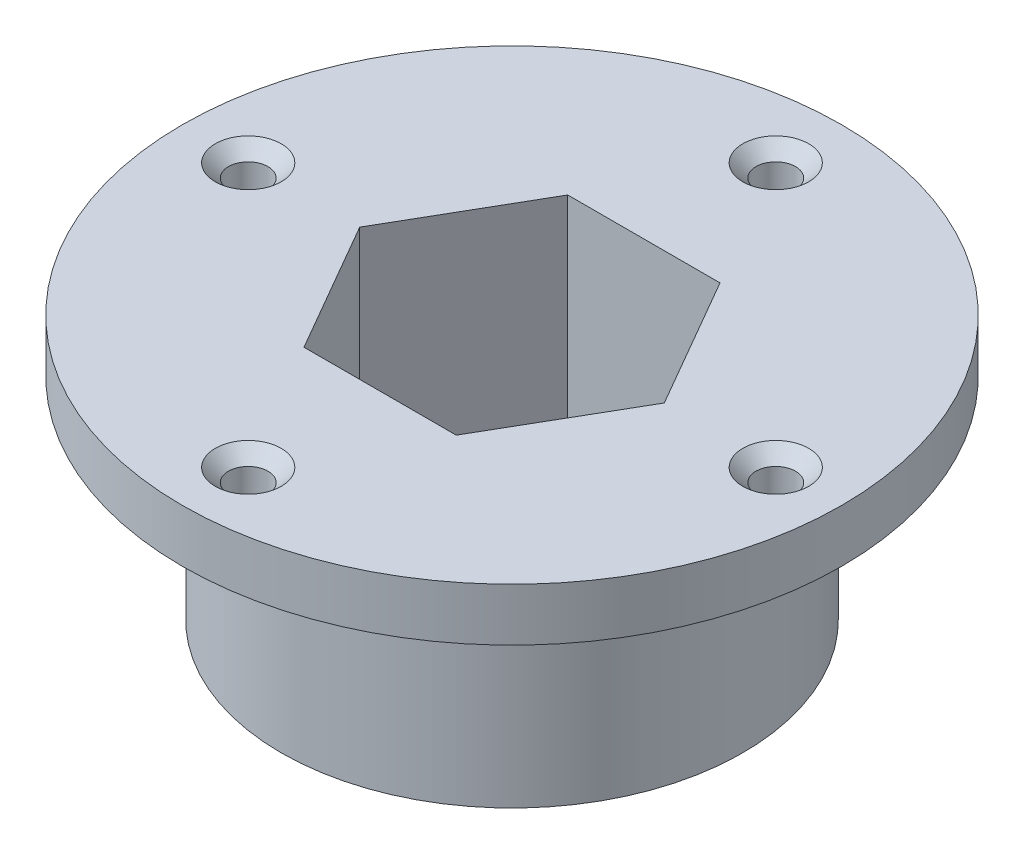
ISO-10303-21;
HEADER;
FILE_DESCRIPTION(('STEP AP214'),'2;1');
FILE_NAME('part.step','',(''),(''),'','','');
FILE_SCHEMA(('AUTOMOTIVE_DESIGN { 1 0 10303 214 1 1 1 1 }'));
ENDSEC;
DATA;
#1=APPLICATION_CONTEXT('core data for automotive mechanical design processes');
#2=APPLICATION_PROTOCOL_DEFINITION('international standard','automotive_design',2000,#1);
#3=PRODUCT_CONTEXT('',#1,'mechanical');
#4=PRODUCT('Part','Part','',(#3));
#5=PRODUCT_RELATED_PRODUCT_CATEGORY('part','',(#4));
#6=PRODUCT_DEFINITION_FORMATION('','',#4);
#7=PRODUCT_DEFINITION_CONTEXT('part definition',#1,'design');
#8=PRODUCT_DEFINITION('design','',#6,#7);
#9=PRODUCT_DEFINITION_SHAPE('','',#8);
#10=(LENGTH_UNIT() NAMED_UNIT(*) SI_UNIT(.MILLI.,.METRE.));
#11=(NAMED_UNIT(*) PLANE_ANGLE_UNIT() SI_UNIT($,.RADIAN.));
#12=(NAMED_UNIT(*) SI_UNIT($,.STERADIAN.) SOLID_ANGLE_UNIT());
#13=UNCERTAINTY_MEASURE_WITH_UNIT(LENGTH_MEASURE(1.E-05),#10,'distance_accuracy_value','');
#14=(GEOMETRIC_REPRESENTATION_CONTEXT(3) GLOBAL_UNCERTAINTY_ASSIGNED_CONTEXT((#13)) GLOBAL_UNIT_ASSIGNED_CONTEXT((#10,
#11,#12)) REPRESENTATION_CONTEXT('',''));
#15=CARTESIAN_POINT('',(0.,0.,0.));
#16=DIRECTION('',(0.,0.,1.));
#17=DIRECTION('',(1.,0.,0.));
#18=AXIS2_PLACEMENT_3D('',#15,#16,#17);
#19=CARTESIAN_POINT('',(0.,0.,0.));
#20=DIRECTION('',(0.,1.,0.));
#21=DIRECTION('',(0.,0.,1.));
#22=AXIS2_PLACEMENT_3D('',#19,#20,#21);
#23=PLANE('',#22);
#24=CARTESIAN_POINT('',(0.,0.,0.));
#25=DIRECTION('',(0.,1.,0.));
#26=DIRECTION('',(0.,0.,1.));
#27=AXIS2_PLACEMENT_3D('',#24,#25,#26);
#28=CIRCLE('',#27,17.5);
#29=CARTESIAN_POINT('',(0.,0.,17.5));
#30=VERTEX_POINT('',#29);
#31=EDGE_CURVE('E199',#30,#30,#28,.T.);
#32=ORIENTED_EDGE('',*,*,#31,.F.);
#33=EDGE_LOOP('',(#32));
#34=FACE_BOUND('',#33,.T.);
#35=DIRECTION('',(1.,0.,0.));
#36=VECTOR('',#35,1.);
#37=CARTESIAN_POINT('',(-5.77350269189626,0.,10.));
#38=LINE('',#37,#36);
#39=CARTESIAN_POINT('',(-5.77350269189626,0.,10.));
#40=VERTEX_POINT('',#39);
#41=CARTESIAN_POINT('',(5.77350269189625,0.,10.));
#42=VERTEX_POINT('',#41);
#43=EDGE_CURVE('E62',#40,#42,#38,.T.);
#44=ORIENTED_EDGE('',*,*,#43,.T.);
#45=DIRECTION('',(0.5,0.,-0.866025403784439));
#46=VECTOR('',#45,1.);
#47=CARTESIAN_POINT('',(5.77350269189625,0.,10.));
#48=LINE('',#47,#46);
#49=CARTESIAN_POINT('',(11.5470053837925,0.,0.));
#50=VERTEX_POINT('',#49);
#51=EDGE_CURVE('E170',#42,#50,#48,.T.);
#52=ORIENTED_EDGE('',*,*,#51,.T.);
#53=DIRECTION('',(-0.5,0.,-0.866025403784439));
#54=VECTOR('',#53,1.);
#55=CARTESIAN_POINT('',(11.5470053837925,0.,0.));
#56=LINE('',#55,#54);
#57=CARTESIAN_POINT('',(5.77350269189627,0.,-10.));
#58=VERTEX_POINT('',#57);
#59=EDGE_CURVE('E174',#50,#58,#56,.T.);
#60=ORIENTED_EDGE('',*,*,#59,.T.);
#61=DIRECTION('',(-1.,0.,0.));
#62=VECTOR('',#61,1.);
#63=CARTESIAN_POINT('',(5.77350269189627,0.,-10.));
#64=LINE('',#63,#62);
#65=CARTESIAN_POINT('',(-5.77350269189626,0.,-10.));
#66=VERTEX_POINT('',#65);
#67=EDGE_CURVE('E107',#58,#66,#64,.T.);
#68=ORIENTED_EDGE('',*,*,#67,.T.);
#69=DIRECTION('',(-0.5,0.,0.866025403784439));
#70=VECTOR('',#69,1.);
#71=CARTESIAN_POINT('',(-5.77350269189626,0.,-10.));
#72=LINE('',#71,#70);
#73=CARTESIAN_POINT('',(-11.5470053837925,0.,0.));
#74=VERTEX_POINT('',#73);
#75=EDGE_CURVE('E179',#66,#74,#72,.T.);
#76=ORIENTED_EDGE('',*,*,#75,.T.);
#77=DIRECTION('',(0.5,0.,0.866025403784439));
#78=VECTOR('',#77,1.);
#79=CARTESIAN_POINT('',(-11.5470053837925,0.,0.));
#80=LINE('',#79,#78);
#81=EDGE_CURVE('E183',#74,#40,#80,.T.);
#82=ORIENTED_EDGE('',*,*,#81,.T.);
#83=EDGE_LOOP('',(#44,#52,#60,#68,#76,#82));
#84=FACE_BOUND('',#83,.T.);
#85=ADVANCED_FACE('F45',(#34,#84),#23,.F.);
#86=CARTESIAN_POINT('',(0.,16.,0.));
#87=DIRECTION('',(0.,-1.,0.));
#88=DIRECTION('',(0.,0.,-1.));
#89=AXIS2_PLACEMENT_3D('',#86,#87,#88);
#90=CYLINDRICAL_SURFACE('',#89,17.5);
#91=CARTESIAN_POINT('',(0.,16.,0.));
#92=DIRECTION('',(0.,1.,0.));
#93=DIRECTION('',(0.,0.,1.));
#94=AXIS2_PLACEMENT_3D('',#91,#92,#93);
#95=CIRCLE('',#94,17.5);
#96=CARTESIAN_POINT('',(0.,16.,17.5));
#97=VERTEX_POINT('',#96);
#98=EDGE_CURVE('E200',#97,#97,#95,.T.);
#99=ORIENTED_EDGE('',*,*,#98,.F.);
#100=EDGE_LOOP('',(#99));
#101=FACE_BOUND('',#100,.T.);
#102=ORIENTED_EDGE('',*,*,#31,.T.);
#103=EDGE_LOOP('',(#102));
#104=FACE_BOUND('',#103,.T.);
#105=ADVANCED_FACE('F252',(#101,#104),#90,.T.);
#106=CARTESIAN_POINT('',(-5.77350269189626,16.,10.));
#107=DIRECTION('',(0.,0.,-1.));
#108=DIRECTION('',(-1.,0.,0.));
#109=AXIS2_PLACEMENT_3D('',#106,#107,#108);
#110=PLANE('',#109);
#111=ORIENTED_EDGE('',*,*,#43,.F.);
#112=DIRECTION('',(0.,-1.,0.));
#113=VECTOR('',#112,1.);
#114=CARTESIAN_POINT('',(-5.77350269189626,16.,10.));
#115=LINE('',#114,#113);
#116=CARTESIAN_POINT('',(-5.77350269189626,20.,10.));
#117=VERTEX_POINT('',#116);
#118=EDGE_CURVE('E187',#117,#40,#115,.T.);
#119=ORIENTED_EDGE('',*,*,#118,.F.);
#120=DIRECTION('',(1.,0.,0.));
#121=VECTOR('',#120,1.);
#122=CARTESIAN_POINT('',(-5.77350269189626,20.,10.));
#123=LINE('',#122,#121);
#124=CARTESIAN_POINT('',(5.77350269189625,20.,10.));
#125=VERTEX_POINT('',#124);
#126=EDGE_CURVE('E133',#117,#125,#123,.T.);
#127=ORIENTED_EDGE('',*,*,#126,.T.);
#128=DIRECTION('',(0.,-1.,0.));
#129=VECTOR('',#128,1.);
#130=CARTESIAN_POINT('',(5.77350269189625,16.,10.));
#131=LINE('',#130,#129);
#132=EDGE_CURVE('E196',#125,#42,#131,.T.);
#133=ORIENTED_EDGE('',*,*,#132,.T.);
#134=EDGE_LOOP('',(#111,#119,#127,#133));
#135=FACE_BOUND('',#134,.T.);
#136=ADVANCED_FACE('F258',(#135),#110,.T.);
#137=CARTESIAN_POINT('',(5.77350269189625,16.,10.));
#138=DIRECTION('',(-0.866025403784438,0.,-0.5));
#139=DIRECTION('',(-0.5,0.,0.866025403784439));
#140=AXIS2_PLACEMENT_3D('',#137,#138,#139);
#141=PLANE('',#140);
#142=ORIENTED_EDGE('',*,*,#51,.F.);
#143=ORIENTED_EDGE('',*,*,#132,.F.);
#144=DIRECTION('',(0.5,0.,-0.866025403784438));
#145=VECTOR('',#144,1.);
#146=CARTESIAN_POINT('',(5.77350269189625,20.,10.));
#147=LINE('',#146,#145);
#148=CARTESIAN_POINT('',(11.5470053837925,20.,0.));
#149=VERTEX_POINT('',#148);
#150=EDGE_CURVE('E130',#125,#149,#147,.T.);
#151=ORIENTED_EDGE('',*,*,#150,.T.);
#152=DIRECTION('',(0.,-1.,0.));
#153=VECTOR('',#152,1.);
#154=CARTESIAN_POINT('',(11.5470053837925,16.,0.));
#155=LINE('',#154,#153);
#156=EDGE_CURVE('E113',#149,#50,#155,.T.);
#157=ORIENTED_EDGE('',*,*,#156,.T.);
#158=EDGE_LOOP('',(#142,#143,#151,#157));
#159=FACE_BOUND('',#158,.T.);
#160=ADVANCED_FACE('F331',(#159),#141,.T.);
#161=CARTESIAN_POINT('',(11.5470053837925,16.,0.));
#162=DIRECTION('',(-0.866025403784439,0.,0.5));
#163=DIRECTION('',(0.5,0.,0.866025403784439));
#164=AXIS2_PLACEMENT_3D('',#161,#162,#163);
#165=PLANE('',#164);
#166=ORIENTED_EDGE('',*,*,#59,.F.);
#167=ORIENTED_EDGE('',*,*,#156,.F.);
#168=DIRECTION('',(-0.5,0.,-0.866025403784439));
#169=VECTOR('',#168,1.);
#170=CARTESIAN_POINT('',(11.5470053837925,20.,0.));
#171=LINE('',#170,#169);
#172=CARTESIAN_POINT('',(5.77350269189627,20.,-10.));
#173=VERTEX_POINT('',#172);
#174=EDGE_CURVE('E121',#149,#173,#171,.T.);
#175=ORIENTED_EDGE('',*,*,#174,.T.);
#176=DIRECTION('',(0.,-1.,0.));
#177=VECTOR('',#176,1.);
#178=CARTESIAN_POINT('',(5.77350269189627,16.,-10.));
#179=LINE('',#178,#177);
#180=EDGE_CURVE('E102',#173,#58,#179,.T.);
#181=ORIENTED_EDGE('',*,*,#180,.T.);
#182=EDGE_LOOP('',(#166,#167,#175,#181));
#183=FACE_BOUND('',#182,.T.);
#184=ADVANCED_FACE('F128',(#183),#165,.T.);
#185=CARTESIAN_POINT('',(5.77350269189627,16.,-10.));
#186=DIRECTION('',(0.,0.,1.));
#187=DIRECTION('',(1.,0.,0.));
#188=AXIS2_PLACEMENT_3D('',#185,#186,#187);
#189=PLANE('',#188);
#190=ORIENTED_EDGE('',*,*,#67,.F.);
#191=ORIENTED_EDGE('',*,*,#180,.F.);
#192=DIRECTION('',(-1.,0.,0.));
#193=VECTOR('',#192,1.);
#194=CARTESIAN_POINT('',(5.77350269189627,20.,-10.));
#195=LINE('',#194,#193);
#196=CARTESIAN_POINT('',(-5.77350269189626,20.,-10.));
#197=VERTEX_POINT('',#196);
#198=EDGE_CURVE('E105',#173,#197,#195,.T.);
#199=ORIENTED_EDGE('',*,*,#198,.T.);
#200=DIRECTION('',(0.,-1.,0.));
#201=VECTOR('',#200,1.);
#202=CARTESIAN_POINT('',(-5.77350269189626,16.,-10.));
#203=LINE('',#202,#201);
#204=EDGE_CURVE('E114',#197,#66,#203,.T.);
#205=ORIENTED_EDGE('',*,*,#204,.T.);
#206=EDGE_LOOP('',(#190,#191,#199,#205));
#207=FACE_BOUND('',#206,.T.);
#208=ADVANCED_FACE('F104',(#207),#189,.T.);
#209=CARTESIAN_POINT('',(-5.77350269189626,16.,-10.));
#210=DIRECTION('',(0.866025403784439,0.,0.5));
#211=DIRECTION('',(0.5,0.,-0.866025403784439));
#212=AXIS2_PLACEMENT_3D('',#209,#210,#211);
#213=PLANE('',#212);
#214=ORIENTED_EDGE('',*,*,#75,.F.);
#215=ORIENTED_EDGE('',*,*,#204,.F.);
#216=DIRECTION('',(-0.5,0.,0.866025403784439));
#217=VECTOR('',#216,1.);
#218=CARTESIAN_POINT('',(-5.77350269189626,20.,-10.));
#219=LINE('',#218,#217);
#220=CARTESIAN_POINT('',(-11.5470053837925,20.,0.));
#221=VERTEX_POINT('',#220);
#222=EDGE_CURVE('E124',#197,#221,#219,.T.);
#223=ORIENTED_EDGE('',*,*,#222,.T.);
#224=DIRECTION('',(0.,-1.,0.));
#225=VECTOR('',#224,1.);
#226=CARTESIAN_POINT('',(-11.5470053837925,16.,0.));
#227=LINE('',#226,#225);
#228=EDGE_CURVE('E70',#221,#74,#227,.T.);
#229=ORIENTED_EDGE('',*,*,#228,.T.);
#230=EDGE_LOOP('',(#214,#215,#223,#229));
#231=FACE_BOUND('',#230,.T.);
#232=ADVANCED_FACE('F324',(#231),#213,.T.);
#233=CARTESIAN_POINT('',(-11.5470053837925,16.,0.));
#234=DIRECTION('',(0.866025403784439,0.,-0.5));
#235=DIRECTION('',(-0.5,0.,-0.866025403784439));
#236=AXIS2_PLACEMENT_3D('',#233,#234,#235);
#237=PLANE('',#236);
#238=ORIENTED_EDGE('',*,*,#81,.F.);
#239=ORIENTED_EDGE('',*,*,#228,.F.);
#240=DIRECTION('',(0.5,0.,0.866025403784439));
#241=VECTOR('',#240,1.);
#242=CARTESIAN_POINT('',(-11.5470053837925,20.,0.));
#243=LINE('',#242,#241);
#244=EDGE_CURVE('E139',#221,#117,#243,.T.);
#245=ORIENTED_EDGE('',*,*,#244,.T.);
#246=ORIENTED_EDGE('',*,*,#118,.T.);
#247=EDGE_LOOP('',(#238,#239,#245,#246));
#248=FACE_BOUND('',#247,.T.);
#249=ADVANCED_FACE('F294',(#248),#237,.T.);
#250=CARTESIAN_POINT('',(0.,16.,0.));
#251=DIRECTION('',(0.,1.,0.));
#252=DIRECTION('',(0.,0.,1.));
#253=AXIS2_PLACEMENT_3D('',#250,#251,#252);
#254=PLANE('',#253);
#255=CARTESIAN_POINT('',(0.,16.,-20.));
#256=DIRECTION('',(0.,1.,0.));
#257=DIRECTION('',(0.,0.,1.));
#258=AXIS2_PLACEMENT_3D('',#255,#256,#257);
#259=CIRCLE('',#258,1.5);
#260=CARTESIAN_POINT('',(0.,16.,-18.5));
#261=VERTEX_POINT('',#260);
#262=EDGE_CURVE('E156',#261,#261,#259,.T.);
#263=ORIENTED_EDGE('',*,*,#262,.T.);
#264=EDGE_LOOP('',(#263));
#265=FACE_BOUND('',#264,.T.);
#266=CARTESIAN_POINT('',(20.0000000000006,16.,-5.64760248210638E-13));
#267=DIRECTION('',(0.,1.,0.));
#268=DIRECTION('',(0.,0.,1.));
#269=AXIS2_PLACEMENT_3D('',#266,#267,#268);
#270=CIRCLE('',#269,1.50000000000044);
#271=CARTESIAN_POINT('',(20.0000000000006,16.,1.49999999999988));
#272=VERTEX_POINT('',#271);
#273=EDGE_CURVE('E152',#272,#272,#270,.T.);
#274=ORIENTED_EDGE('',*,*,#273,.T.);
#275=EDGE_LOOP('',(#274));
#276=FACE_BOUND('',#275,.T.);
#277=CARTESIAN_POINT('',(1.12952049642128E-12,16.,20.));
#278=DIRECTION('',(0.,1.,0.));
#279=DIRECTION('',(0.,0.,1.));
#280=AXIS2_PLACEMENT_3D('',#277,#278,#279);
#281=CIRCLE('',#280,1.50000000000121);
#282=CARTESIAN_POINT('',(1.12952049642128E-12,16.,21.5000000000012));
#283=VERTEX_POINT('',#282);
#284=EDGE_CURVE('E148',#283,#283,#281,.T.);
#285=ORIENTED_EDGE('',*,*,#284,.T.);
#286=EDGE_LOOP('',(#285));
#287=FACE_BOUND('',#286,.T.);
#288=CARTESIAN_POINT('',(-19.9999999999994,16.,5.67209541808933E-13));
#289=DIRECTION('',(0.,1.,0.));
#290=DIRECTION('',(0.,0.,1.));
#291=AXIS2_PLACEMENT_3D('',#288,#289,#290);
#292=CIRCLE('',#291,1.50000000000091);
#293=CARTESIAN_POINT('',(-19.9999999999994,16.,1.50000000000147));
#294=VERTEX_POINT('',#293);
#295=EDGE_CURVE('E126',#294,#294,#292,.T.);
#296=ORIENTED_EDGE('',*,*,#295,.T.);
#297=EDGE_LOOP('',(#296));
#298=FACE_BOUND('',#297,.T.);
#299=CARTESIAN_POINT('',(0.,16.,0.));
#300=DIRECTION('',(0.,1.,0.));
#301=DIRECTION('',(0.,0.,1.));
#302=AXIS2_PLACEMENT_3D('',#299,#300,#301);
#303=CIRCLE('',#302,25.);
#304=CARTESIAN_POINT('',(0.,16.,25.));
#305=VERTEX_POINT('',#304);
#306=EDGE_CURVE('E160',#305,#305,#303,.T.);
#307=ORIENTED_EDGE('',*,*,#306,.F.);
#308=EDGE_LOOP('',(#307));
#309=FACE_BOUND('',#308,.T.);
#310=ORIENTED_EDGE('',*,*,#98,.T.);
#311=EDGE_LOOP('',(#310));
#312=FACE_BOUND('',#311,.T.);
#313=ADVANCED_FACE('F291',(#265,#276,#287,#298,#309,#312),#254,.F.);
#314=CARTESIAN_POINT('',(0.,20.,0.));
#315=DIRECTION('',(0.,1.,0.));
#316=DIRECTION('',(0.,0.,1.));
#317=AXIS2_PLACEMENT_3D('',#314,#315,#316);
#318=PLANE('',#317);
#319=CARTESIAN_POINT('',(0.,20.,-20.));
#320=DIRECTION('',(0.,1.,0.));
#321=DIRECTION('',(0.,0.,1.));
#322=AXIS2_PLACEMENT_3D('',#319,#320,#321);
#323=CIRCLE('',#322,2.50000000000001);
#324=CARTESIAN_POINT('',(0.,20.,-17.5));
#325=VERTEX_POINT('',#324);
#326=EDGE_CURVE('E223',#325,#325,#323,.F.);
#327=ORIENTED_EDGE('',*,*,#326,.T.);
#328=EDGE_LOOP('',(#327));
#329=FACE_BOUND('',#328,.T.);
#330=CARTESIAN_POINT('',(20.0000000000006,20.,-5.64760248210638E-13));
#331=DIRECTION('',(0.,1.,0.));
#332=DIRECTION('',(0.,0.,1.));
#333=AXIS2_PLACEMENT_3D('',#330,#331,#332);
#334=CIRCLE('',#333,2.50000000000046);
#335=CARTESIAN_POINT('',(20.0000000000006,20.,2.4999999999999));
#336=VERTEX_POINT('',#335);
#337=EDGE_CURVE('E219',#336,#336,#334,.F.);
#338=ORIENTED_EDGE('',*,*,#337,.T.);
#339=EDGE_LOOP('',(#338));
#340=FACE_BOUND('',#339,.T.);
#341=CARTESIAN_POINT('',(1.12952049642128E-12,20.,20.));
#342=DIRECTION('',(0.,1.,0.));
#343=DIRECTION('',(0.,0.,1.));
#344=AXIS2_PLACEMENT_3D('',#341,#342,#343);
#345=CIRCLE('',#344,2.50000000000122);
#346=CARTESIAN_POINT('',(1.12952049642128E-12,20.,22.5000000000012));
#347=VERTEX_POINT('',#346);
#348=EDGE_CURVE('E215',#347,#347,#345,.F.);
#349=ORIENTED_EDGE('',*,*,#348,.T.);
#350=EDGE_LOOP('',(#349));
#351=FACE_BOUND('',#350,.T.);
#352=CARTESIAN_POINT('',(-19.9999999999994,20.,5.67209541808933E-13));
#353=DIRECTION('',(0.,1.,0.));
#354=DIRECTION('',(0.,0.,1.));
#355=AXIS2_PLACEMENT_3D('',#352,#353,#354);
#356=CIRCLE('',#355,2.50000000000092);
#357=CARTESIAN_POINT('',(-19.9999999999994,20.,2.50000000000149));
#358=VERTEX_POINT('',#357);
#359=EDGE_CURVE('E211',#358,#358,#356,.F.);
#360=ORIENTED_EDGE('',*,*,#359,.T.);
#361=EDGE_LOOP('',(#360));
#362=FACE_BOUND('',#361,.T.);
#363=CARTESIAN_POINT('',(0.,20.,0.));
#364=DIRECTION('',(0.,1.,0.));
#365=DIRECTION('',(0.,0.,1.));
#366=AXIS2_PLACEMENT_3D('',#363,#364,#365);
#367=CIRCLE('',#366,25.);
#368=CARTESIAN_POINT('',(0.,20.,25.));
#369=VERTEX_POINT('',#368);
#370=EDGE_CURVE('E161',#369,#369,#367,.T.);
#371=ORIENTED_EDGE('',*,*,#370,.T.);
#372=EDGE_LOOP('',(#371));
#373=FACE_BOUND('',#372,.T.);
#374=ORIENTED_EDGE('',*,*,#222,.F.);
#375=ORIENTED_EDGE('',*,*,#198,.F.);
#376=ORIENTED_EDGE('',*,*,#174,.F.);
#377=ORIENTED_EDGE('',*,*,#150,.F.);
#378=ORIENTED_EDGE('',*,*,#126,.F.);
#379=ORIENTED_EDGE('',*,*,#244,.F.);
#380=EDGE_LOOP('',(#374,#375,#376,#377,#378,#379));
#381=FACE_BOUND('',#380,.T.);
#382=ADVANCED_FACE('F119',(#329,#340,#351,#362,#373,#381),#318,.T.);
#383=CARTESIAN_POINT('',(0.,20.,0.));
#384=DIRECTION('',(0.,-1.,0.));
#385=DIRECTION('',(0.,0.,-1.));
#386=AXIS2_PLACEMENT_3D('',#383,#384,#385);
#387=CYLINDRICAL_SURFACE('',#386,25.);
#388=ORIENTED_EDGE('',*,*,#370,.F.);
#389=EDGE_LOOP('',(#388));
#390=FACE_BOUND('',#389,.T.);
#391=ORIENTED_EDGE('',*,*,#306,.T.);
#392=EDGE_LOOP('',(#391));
#393=FACE_BOUND('',#392,.T.);
#394=ADVANCED_FACE('F307',(#390,#393),#387,.T.);
#395=CARTESIAN_POINT('',(-19.9999999999994,0.,5.67209541808933E-13));
#396=DIRECTION('',(0.,1.,0.));
#397=DIRECTION('',(0.,0.,1.));
#398=AXIS2_PLACEMENT_3D('',#395,#396,#397);
#399=CYLINDRICAL_SURFACE('',#398,1.50000000000091);
#400=CARTESIAN_POINT('',(-19.9999999999994,19.,5.67209541808933E-13));
#401=DIRECTION('',(0.,1.,0.));
#402=DIRECTION('',(0.,0.,1.));
#403=AXIS2_PLACEMENT_3D('',#400,#401,#402);
#404=CIRCLE('',#403,1.50000000000091);
#405=CARTESIAN_POINT('',(-19.9999999999994,19.,1.50000000000147));
#406=VERTEX_POINT('',#405);
#407=EDGE_CURVE('E11',#406,#406,#404,.T.);
#408=ORIENTED_EDGE('',*,*,#407,.T.);
#409=EDGE_LOOP('',(#408));
#410=FACE_BOUND('',#409,.T.);
#411=ORIENTED_EDGE('',*,*,#295,.F.);
#412=EDGE_LOOP('',(#411));
#413=FACE_BOUND('',#412,.T.);
#414=ADVANCED_FACE('F309',(#410,#413),#399,.F.);
#415=CARTESIAN_POINT('',(1.12952049642128E-12,0.,20.));
#416=DIRECTION('',(0.,1.,0.));
#417=DIRECTION('',(0.,0.,1.));
#418=AXIS2_PLACEMENT_3D('',#415,#416,#417);
#419=CYLINDRICAL_SURFACE('',#418,1.50000000000121);
#420=CARTESIAN_POINT('',(1.12952049642128E-12,19.,20.));
#421=DIRECTION('',(0.,1.,0.));
#422=DIRECTION('',(0.,0.,1.));
#423=AXIS2_PLACEMENT_3D('',#420,#421,#422);
#424=CIRCLE('',#423,1.50000000000121);
#425=CARTESIAN_POINT('',(1.12952049642128E-12,19.,21.5000000000012));
#426=VERTEX_POINT('',#425);
#427=EDGE_CURVE('E55',#426,#426,#424,.T.);
#428=ORIENTED_EDGE('',*,*,#427,.T.);
#429=EDGE_LOOP('',(#428));
#430=FACE_BOUND('',#429,.T.);
#431=ORIENTED_EDGE('',*,*,#284,.F.);
#432=EDGE_LOOP('',(#431));
#433=FACE_BOUND('',#432,.T.);
#434=ADVANCED_FACE('F234',(#430,#433),#419,.F.);
#435=CARTESIAN_POINT('',(20.0000000000006,0.,-5.64760248210638E-13));
#436=DIRECTION('',(0.,1.,0.));
#437=DIRECTION('',(0.,0.,1.));
#438=AXIS2_PLACEMENT_3D('',#435,#436,#437);
#439=CYLINDRICAL_SURFACE('',#438,1.50000000000044);
#440=CARTESIAN_POINT('',(20.0000000000006,19.,-5.64760248210638E-13));
#441=DIRECTION('',(0.,1.,0.));
#442=DIRECTION('',(0.,0.,1.));
#443=AXIS2_PLACEMENT_3D('',#440,#441,#442);
#444=CIRCLE('',#443,1.50000000000044);
#445=CARTESIAN_POINT('',(20.0000000000006,19.,1.49999999999988));
#446=VERTEX_POINT('',#445);
#447=EDGE_CURVE('E227',#446,#446,#444,.T.);
#448=ORIENTED_EDGE('',*,*,#447,.T.);
#449=EDGE_LOOP('',(#448));
#450=FACE_BOUND('',#449,.T.);
#451=ORIENTED_EDGE('',*,*,#273,.F.);
#452=EDGE_LOOP('',(#451));
#453=FACE_BOUND('',#452,.T.);
#454=ADVANCED_FACE('F282',(#450,#453),#439,.F.);
#455=CARTESIAN_POINT('',(0.,0.,-20.));
#456=DIRECTION('',(0.,1.,0.));
#457=DIRECTION('',(0.,0.,1.));
#458=AXIS2_PLACEMENT_3D('',#455,#456,#457);
#459=CYLINDRICAL_SURFACE('',#458,1.5);
#460=CARTESIAN_POINT('',(0.,19.,-20.));
#461=DIRECTION('',(0.,1.,0.));
#462=DIRECTION('',(0.,0.,1.));
#463=AXIS2_PLACEMENT_3D('',#460,#461,#462);
#464=CIRCLE('',#463,1.5);
#465=CARTESIAN_POINT('',(0.,19.,-18.5));
#466=VERTEX_POINT('',#465);
#467=EDGE_CURVE('E204',#466,#466,#464,.T.);
#468=ORIENTED_EDGE('',*,*,#467,.T.);
#469=EDGE_LOOP('',(#468));
#470=FACE_BOUND('',#469,.T.);
#471=ORIENTED_EDGE('',*,*,#262,.F.);
#472=EDGE_LOOP('',(#471));
#473=FACE_BOUND('',#472,.T.);
#474=ADVANCED_FACE('F271',(#470,#473),#459,.F.);
#475=CARTESIAN_POINT('',(0.,19.,-20.));
#476=DIRECTION('',(0.,1.,0.));
#477=DIRECTION('',(0.,0.,1.));
#478=AXIS2_PLACEMENT_3D('',#475,#476,#477);
#479=CONICAL_SURFACE('',#478,1.5,0.785398163397449);
#480=ORIENTED_EDGE('',*,*,#326,.F.);
#481=EDGE_LOOP('',(#480));
#482=FACE_BOUND('',#481,.T.);
#483=ORIENTED_EDGE('',*,*,#467,.F.);
#484=EDGE_LOOP('',(#483));
#485=FACE_BOUND('',#484,.T.);
#486=ADVANCED_FACE('F246',(#482,#485),#479,.F.);
#487=CARTESIAN_POINT('',(20.0000000000006,19.,-5.64760248210638E-13));
#488=DIRECTION('',(0.,1.,0.));
#489=DIRECTION('',(0.,0.,1.));
#490=AXIS2_PLACEMENT_3D('',#487,#488,#489);
#491=CONICAL_SURFACE('',#490,1.50000000000044,0.78539816339745);
#492=ORIENTED_EDGE('',*,*,#337,.F.);
#493=EDGE_LOOP('',(#492));
#494=FACE_BOUND('',#493,.T.);
#495=ORIENTED_EDGE('',*,*,#447,.F.);
#496=EDGE_LOOP('',(#495));
#497=FACE_BOUND('',#496,.T.);
#498=ADVANCED_FACE('F239',(#494,#497),#491,.F.);
#499=CARTESIAN_POINT('',(1.12952049642128E-12,19.,20.));
#500=DIRECTION('',(0.,1.,0.));
#501=DIRECTION('',(0.,0.,1.));
#502=AXIS2_PLACEMENT_3D('',#499,#500,#501);
#503=CONICAL_SURFACE('',#502,1.50000000000121,0.785398163397449);
#504=ORIENTED_EDGE('',*,*,#348,.F.);
#505=EDGE_LOOP('',(#504));
#506=FACE_BOUND('',#505,.T.);
#507=ORIENTED_EDGE('',*,*,#427,.F.);
#508=EDGE_LOOP('',(#507));
#509=FACE_BOUND('',#508,.T.);
#510=ADVANCED_FACE('F237',(#506,#509),#503,.F.);
#511=CARTESIAN_POINT('',(-19.9999999999994,19.,5.67209541808933E-13));
#512=DIRECTION('',(0.,1.,0.));
#513=DIRECTION('',(0.,0.,1.));
#514=AXIS2_PLACEMENT_3D('',#511,#512,#513);
#515=CONICAL_SURFACE('',#514,1.50000000000091,0.78539816339745);
#516=ORIENTED_EDGE('',*,*,#359,.F.);
#517=EDGE_LOOP('',(#516));
#518=FACE_BOUND('',#517,.T.);
#519=ORIENTED_EDGE('',*,*,#407,.F.);
#520=EDGE_LOOP('',(#519));
#521=FACE_BOUND('',#520,.T.);
#522=ADVANCED_FACE('F48',(#518,#521),#515,.F.);
#523=CLOSED_SHELL('',(#85,#105,#136,#160,#184,#208,#232,#249,#313,#382,#394,#414,#434,#454,#474,
#486,#498,#510,#522));
#524=MANIFOLD_SOLID_BREP('B2',#523);
#525=ADVANCED_BREP_SHAPE_REPRESENTATION('',(#18,#524),#14);
#526=SHAPE_DEFINITION_REPRESENTATION(#9,#525);
ENDSEC;
END-ISO-10303-21;
